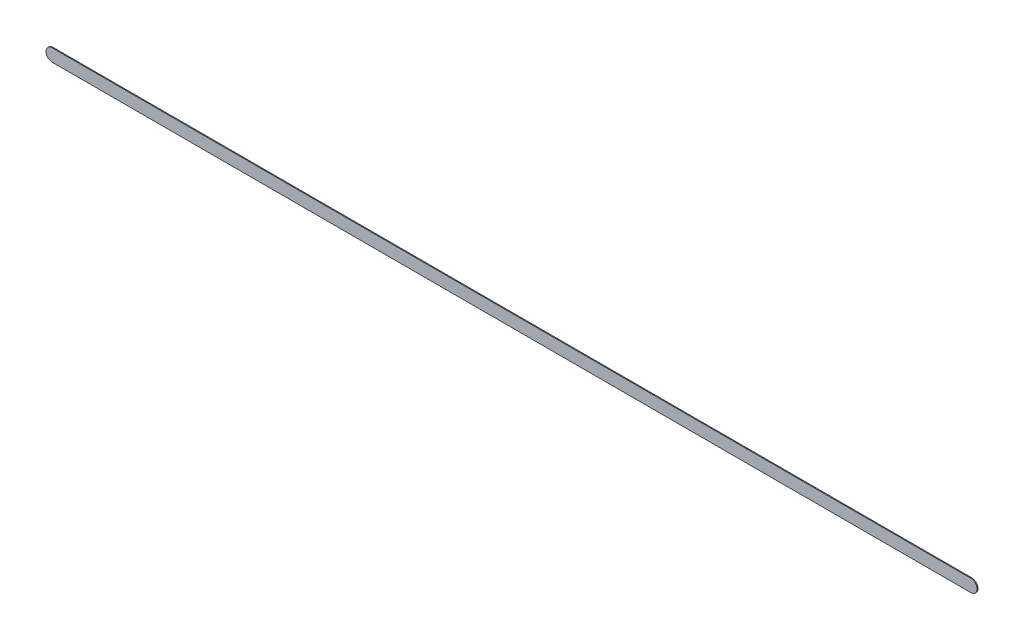
ISO-10303-21;
HEADER;
FILE_DESCRIPTION(('STEP AP214'),'2;1');
FILE_NAME('part.step','',(''),(''),'','','');
FILE_SCHEMA(('AUTOMOTIVE_DESIGN { 1 0 10303 214 1 1 1 1 }'));
ENDSEC;
DATA;
#1=APPLICATION_CONTEXT('core data for automotive mechanical design processes');
#2=APPLICATION_PROTOCOL_DEFINITION('international standard','automotive_design',2000,#1);
#3=PRODUCT_CONTEXT('',#1,'mechanical');
#4=PRODUCT('Part','Part','',(#3));
#5=PRODUCT_RELATED_PRODUCT_CATEGORY('part','',(#4));
#6=PRODUCT_DEFINITION_FORMATION('','',#4);
#7=PRODUCT_DEFINITION_CONTEXT('part definition',#1,'design');
#8=PRODUCT_DEFINITION('design','',#6,#7);
#9=PRODUCT_DEFINITION_SHAPE('','',#8);
#10=(LENGTH_UNIT() NAMED_UNIT(*) SI_UNIT(.MILLI.,.METRE.));
#11=(NAMED_UNIT(*) PLANE_ANGLE_UNIT() SI_UNIT($,.RADIAN.));
#12=(NAMED_UNIT(*) SI_UNIT($,.STERADIAN.) SOLID_ANGLE_UNIT());
#13=UNCERTAINTY_MEASURE_WITH_UNIT(LENGTH_MEASURE(1.E-05),#10,'distance_accuracy_value','');
#14=(GEOMETRIC_REPRESENTATION_CONTEXT(3) GLOBAL_UNCERTAINTY_ASSIGNED_CONTEXT((#13)) GLOBAL_UNIT_ASSIGNED_CONTEXT((#10,
#11,#12)) REPRESENTATION_CONTEXT('',''));
#15=CARTESIAN_POINT('',(0.,0.,0.));
#16=DIRECTION('',(0.,0.,1.));
#17=DIRECTION('',(1.,0.,0.));
#18=AXIS2_PLACEMENT_3D('',#15,#16,#17);
#19=CARTESIAN_POINT('',(74.871199,62.7500015,0.));
#20=DIRECTION('',(0.,1.,0.));
#21=DIRECTION('',(1.,0.,0.));
#22=AXIS2_PLACEMENT_3D('',#19,#20,#21);
#23=PLANE('',#22);
#24=DIRECTION('',(1.,0.,0.));
#25=VECTOR('',#24,1.);
#26=CARTESIAN_POINT('',(74.871199,62.7500015,0.03556));
#27=LINE('',#26,#25);
#28=CARTESIAN_POINT('',(74.871199,62.7500015,0.03556));
#29=VERTEX_POINT('',#28);
#30=CARTESIAN_POINT('',(111.7400102,62.7500015,0.03556));
#31=VERTEX_POINT('',#30);
#32=EDGE_CURVE('E11',#29,#31,#27,.T.);
#33=ORIENTED_EDGE('',*,*,#32,.F.);
#34=DIRECTION('',(0.,0.,1.));
#35=VECTOR('',#34,1.);
#36=CARTESIAN_POINT('',(74.871199,62.7500015,0.));
#37=LINE('',#36,#35);
#38=CARTESIAN_POINT('',(74.871199,62.7500015,0.));
#39=VERTEX_POINT('',#38);
#40=EDGE_CURVE('E24',#39,#29,#37,.T.);
#41=ORIENTED_EDGE('',*,*,#40,.F.);
#42=DIRECTION('',(1.,0.,0.));
#43=VECTOR('',#42,1.);
#44=CARTESIAN_POINT('',(74.871199,62.7500015,0.));
#45=LINE('',#44,#43);
#46=CARTESIAN_POINT('',(111.7400102,62.7500015,0.));
#47=VERTEX_POINT('',#46);
#48=EDGE_CURVE('E75',#39,#47,#45,.T.);
#49=ORIENTED_EDGE('',*,*,#48,.T.);
#50=DIRECTION('',(0.,0.,1.));
#51=VECTOR('',#50,1.);
#52=CARTESIAN_POINT('',(111.7400102,62.7500015,0.));
#53=LINE('',#52,#51);
#54=EDGE_CURVE('E37',#47,#31,#53,.T.);
#55=ORIENTED_EDGE('',*,*,#54,.T.);
#56=EDGE_LOOP('',(#33,#41,#49,#55));
#57=FACE_BOUND('',#56,.T.);
#58=ADVANCED_FACE('F17',(#57),#23,.F.);
#59=CARTESIAN_POINT('',(111.7400102,63.000001,0.));
#60=DIRECTION('',(0.,0.,-1.));
#61=DIRECTION('',(0.,-1.,0.));
#62=AXIS2_PLACEMENT_3D('',#59,#60,#61);
#63=CYLINDRICAL_SURFACE('',#62,0.249999499999999);
#64=CARTESIAN_POINT('',(111.7400102,63.000001,0.03556));
#65=DIRECTION('',(0.,0.,1.));
#66=DIRECTION('',(0.,-1.,0.));
#67=AXIS2_PLACEMENT_3D('',#64,#65,#66);
#68=CIRCLE('',#67,0.249999499999999);
#69=CARTESIAN_POINT('',(111.7400102,63.2500005,0.03556));
#70=VERTEX_POINT('',#69);
#71=EDGE_CURVE('E83',#31,#70,#68,.T.);
#72=ORIENTED_EDGE('',*,*,#71,.F.);
#73=ORIENTED_EDGE('',*,*,#54,.F.);
#74=CARTESIAN_POINT('',(111.7400102,63.000001,0.));
#75=DIRECTION('',(0.,0.,1.));
#76=DIRECTION('',(0.,-1.,0.));
#77=AXIS2_PLACEMENT_3D('',#74,#75,#76);
#78=CIRCLE('',#77,0.249999499999999);
#79=CARTESIAN_POINT('',(111.7400102,63.2500005,0.));
#80=VERTEX_POINT('',#79);
#81=EDGE_CURVE('E81',#47,#80,#78,.T.);
#82=ORIENTED_EDGE('',*,*,#81,.T.);
#83=DIRECTION('',(0.,0.,1.));
#84=VECTOR('',#83,1.);
#85=CARTESIAN_POINT('',(111.7400102,63.2500005,0.));
#86=LINE('',#85,#84);
#87=EDGE_CURVE('E67',#80,#70,#86,.T.);
#88=ORIENTED_EDGE('',*,*,#87,.T.);
#89=EDGE_LOOP('',(#72,#73,#82,#88));
#90=FACE_BOUND('',#89,.T.);
#91=ADVANCED_FACE('F89',(#90),#63,.T.);
#92=CARTESIAN_POINT('',(111.7400102,63.2500005,0.));
#93=DIRECTION('',(0.,-1.,0.));
#94=DIRECTION('',(-1.,0.,0.));
#95=AXIS2_PLACEMENT_3D('',#92,#93,#94);
#96=PLANE('',#95);
#97=DIRECTION('',(-1.,0.,0.));
#98=VECTOR('',#97,1.);
#99=CARTESIAN_POINT('',(111.7400102,63.2500005,0.03556));
#100=LINE('',#99,#98);
#101=CARTESIAN_POINT('',(74.871199,63.2500005,0.03556));
#102=VERTEX_POINT('',#101);
#103=EDGE_CURVE('E71',#70,#102,#100,.T.);
#104=ORIENTED_EDGE('',*,*,#103,.F.);
#105=ORIENTED_EDGE('',*,*,#87,.F.);
#106=DIRECTION('',(-1.,0.,0.));
#107=VECTOR('',#106,1.);
#108=CARTESIAN_POINT('',(111.7400102,63.2500005,0.));
#109=LINE('',#108,#107);
#110=CARTESIAN_POINT('',(74.871199,63.2500005,0.));
#111=VERTEX_POINT('',#110);
#112=EDGE_CURVE('E63',#80,#111,#109,.T.);
#113=ORIENTED_EDGE('',*,*,#112,.T.);
#114=DIRECTION('',(0.,0.,1.));
#115=VECTOR('',#114,1.);
#116=CARTESIAN_POINT('',(74.871199,63.2500005,0.));
#117=LINE('',#116,#115);
#118=EDGE_CURVE('E53',#111,#102,#117,.T.);
#119=ORIENTED_EDGE('',*,*,#118,.T.);
#120=EDGE_LOOP('',(#104,#105,#113,#119));
#121=FACE_BOUND('',#120,.T.);
#122=ADVANCED_FACE('F66',(#121),#96,.F.);
#123=CARTESIAN_POINT('',(74.871199,63.000001,0.));
#124=DIRECTION('',(0.,0.,-1.));
#125=DIRECTION('',(0.,1.,0.));
#126=AXIS2_PLACEMENT_3D('',#123,#124,#125);
#127=CYLINDRICAL_SURFACE('',#126,0.249999499999999);
#128=CARTESIAN_POINT('',(74.871199,63.000001,0.03556));
#129=DIRECTION('',(0.,0.,1.));
#130=DIRECTION('',(0.,1.,0.));
#131=AXIS2_PLACEMENT_3D('',#128,#129,#130);
#132=CIRCLE('',#131,0.249999499999999);
#133=EDGE_CURVE('E59',#102,#29,#132,.T.);
#134=ORIENTED_EDGE('',*,*,#133,.F.);
#135=ORIENTED_EDGE('',*,*,#118,.F.);
#136=CARTESIAN_POINT('',(74.871199,63.000001,0.));
#137=DIRECTION('',(0.,0.,1.));
#138=DIRECTION('',(0.,1.,0.));
#139=AXIS2_PLACEMENT_3D('',#136,#137,#138);
#140=CIRCLE('',#139,0.249999499999999);
#141=EDGE_CURVE('E57',#111,#39,#140,.T.);
#142=ORIENTED_EDGE('',*,*,#141,.T.);
#143=ORIENTED_EDGE('',*,*,#40,.T.);
#144=EDGE_LOOP('',(#134,#135,#142,#143));
#145=FACE_BOUND('',#144,.T.);
#146=ADVANCED_FACE('F55',(#145),#127,.T.);
#147=CARTESIAN_POINT('',(74.871199,62.7500015,0.));
#148=DIRECTION('',(0.,0.,-1.));
#149=DIRECTION('',(-1.,0.,0.));
#150=AXIS2_PLACEMENT_3D('',#147,#148,#149);
#151=PLANE('',#150);
#152=ORIENTED_EDGE('',*,*,#141,.F.);
#153=ORIENTED_EDGE('',*,*,#112,.F.);
#154=ORIENTED_EDGE('',*,*,#81,.F.);
#155=ORIENTED_EDGE('',*,*,#48,.F.);
#156=EDGE_LOOP('',(#152,#153,#154,#155));
#157=FACE_BOUND('',#156,.T.);
#158=ADVANCED_FACE('F74',(#157),#151,.T.);
#159=CARTESIAN_POINT('',(74.871199,62.7500015,0.03556));
#160=DIRECTION('',(0.,0.,-1.));
#161=DIRECTION('',(-1.,0.,0.));
#162=AXIS2_PLACEMENT_3D('',#159,#160,#161);
#163=PLANE('',#162);
#164=ORIENTED_EDGE('',*,*,#32,.T.);
#165=ORIENTED_EDGE('',*,*,#71,.T.);
#166=ORIENTED_EDGE('',*,*,#103,.T.);
#167=ORIENTED_EDGE('',*,*,#133,.T.);
#168=EDGE_LOOP('',(#164,#165,#166,#167));
#169=FACE_BOUND('',#168,.T.);
#170=ADVANCED_FACE('F91',(#169),#163,.F.);
#171=CLOSED_SHELL('',(#58,#91,#122,#146,#158,#170));
#172=MANIFOLD_SOLID_BREP('B1',#171);
#173=ADVANCED_BREP_SHAPE_REPRESENTATION('',(#18,#172),#14);
#174=SHAPE_DEFINITION_REPRESENTATION(#9,#173);
ENDSEC;
END-ISO-10303-21;
